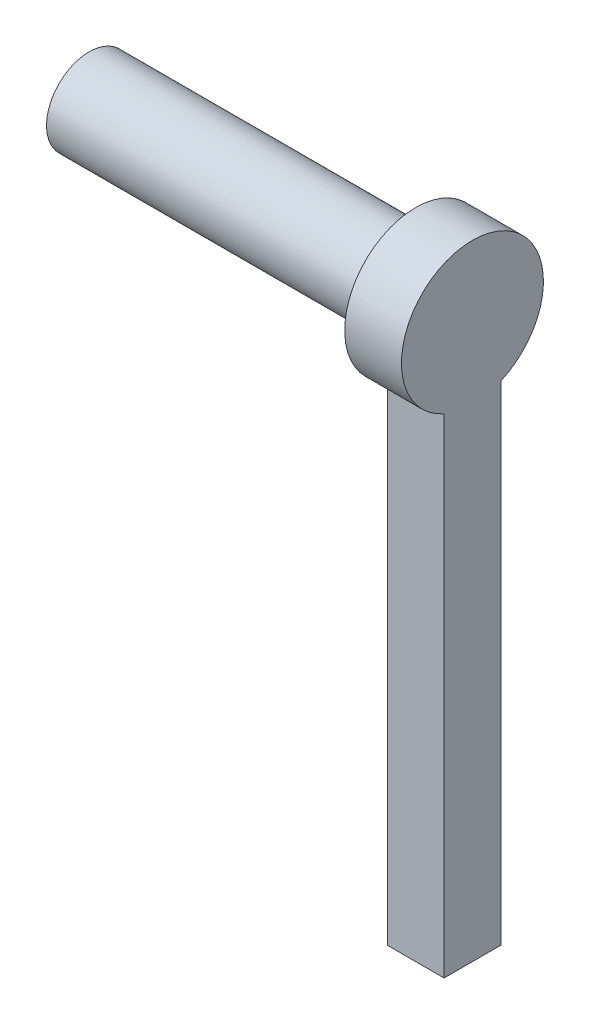
ISO-10303-21;
HEADER;
FILE_DESCRIPTION(('STEP AP214'),'2;1');
FILE_NAME('part.step','',(''),(''),'','','');
FILE_SCHEMA(('AUTOMOTIVE_DESIGN { 1 0 10303 214 1 1 1 1 }'));
ENDSEC;
DATA;
#1=APPLICATION_CONTEXT('core data for automotive mechanical design processes');
#2=APPLICATION_PROTOCOL_DEFINITION('international standard','automotive_design',2000,#1);
#3=PRODUCT_CONTEXT('',#1,'mechanical');
#4=PRODUCT('Part','Part','',(#3));
#5=PRODUCT_RELATED_PRODUCT_CATEGORY('part','',(#4));
#6=PRODUCT_DEFINITION_FORMATION('','',#4);
#7=PRODUCT_DEFINITION_CONTEXT('part definition',#1,'design');
#8=PRODUCT_DEFINITION('design','',#6,#7);
#9=PRODUCT_DEFINITION_SHAPE('','',#8);
#10=(LENGTH_UNIT() NAMED_UNIT(*) SI_UNIT(.MILLI.,.METRE.));
#11=(NAMED_UNIT(*) PLANE_ANGLE_UNIT() SI_UNIT($,.RADIAN.));
#12=(NAMED_UNIT(*) SI_UNIT($,.STERADIAN.) SOLID_ANGLE_UNIT());
#13=UNCERTAINTY_MEASURE_WITH_UNIT(LENGTH_MEASURE(1.E-05),#10,'distance_accuracy_value','');
#14=(GEOMETRIC_REPRESENTATION_CONTEXT(3) GLOBAL_UNCERTAINTY_ASSIGNED_CONTEXT((#13)) GLOBAL_UNIT_ASSIGNED_CONTEXT((#10,
#11,#12)) REPRESENTATION_CONTEXT('',''));
#15=CARTESIAN_POINT('',(0.,0.,0.));
#16=DIRECTION('',(0.,0.,1.));
#17=DIRECTION('',(1.,0.,0.));
#18=AXIS2_PLACEMENT_3D('',#15,#16,#17);
#19=CARTESIAN_POINT('',(-0.5,-29.,-10.5));
#20=DIRECTION('',(-1.,0.,0.));
#21=DIRECTION('',(0.,0.,1.));
#22=AXIS2_PLACEMENT_3D('',#19,#20,#21);
#23=CYLINDRICAL_SURFACE('',#22,1.5);
#24=CARTESIAN_POINT('',(-0.5,-29.,-10.5));
#25=DIRECTION('',(1.,0.,0.));
#26=DIRECTION('',(0.,0.,-1.));
#27=AXIS2_PLACEMENT_3D('',#24,#25,#26);
#28=CIRCLE('',#27,1.5);
#29=CARTESIAN_POINT('',(-0.5,-29.,-12.));
#30=VERTEX_POINT('',#29);
#31=EDGE_CURVE('E11',#30,#30,#28,.T.);
#32=ORIENTED_EDGE('',*,*,#31,.F.);
#33=EDGE_LOOP('',(#32));
#34=FACE_BOUND('',#33,.T.);
#35=CARTESIAN_POINT('',(-12.,-29.,-10.5));
#36=DIRECTION('',(1.,0.,0.));
#37=DIRECTION('',(0.,0.,-1.));
#38=AXIS2_PLACEMENT_3D('',#35,#36,#37);
#39=CIRCLE('',#38,1.5);
#40=CARTESIAN_POINT('',(-12.,-29.,-12.));
#41=VERTEX_POINT('',#40);
#42=EDGE_CURVE('E42',#41,#41,#39,.T.);
#43=ORIENTED_EDGE('',*,*,#42,.T.);
#44=EDGE_LOOP('',(#43));
#45=FACE_BOUND('',#44,.T.);
#46=ADVANCED_FACE('F41',(#34,#45),#23,.T.);
#47=CARTESIAN_POINT('',(-12.,-29.,-10.5));
#48=DIRECTION('',(1.,0.,0.));
#49=DIRECTION('',(0.,0.,-1.));
#50=AXIS2_PLACEMENT_3D('',#47,#48,#49);
#51=PLANE('',#50);
#52=ORIENTED_EDGE('',*,*,#42,.F.);
#53=EDGE_LOOP('',(#52));
#54=FACE_BOUND('',#53,.T.);
#55=ADVANCED_FACE('F128',(#54),#51,.F.);
#56=CARTESIAN_POINT('',(1.5,-29.,-10.5));
#57=DIRECTION('',(-1.,0.,0.));
#58=DIRECTION('',(0.,0.,1.));
#59=AXIS2_PLACEMENT_3D('',#56,#57,#58);
#60=CYLINDRICAL_SURFACE('',#59,2.5);
#61=CARTESIAN_POINT('',(-0.5,-29.,-10.5));
#62=DIRECTION('',(1.,0.,0.));
#63=DIRECTION('',(0.,0.,-1.));
#64=AXIS2_PLACEMENT_3D('',#61,#62,#63);
#65=CIRCLE('',#64,2.5);
#66=CARTESIAN_POINT('',(-0.5,-31.2912878474779,-11.5));
#67=VERTEX_POINT('',#66);
#68=CARTESIAN_POINT('',(-0.5,-31.2912878474779,-9.5));
#69=VERTEX_POINT('',#68);
#70=EDGE_CURVE('E108',#67,#69,#65,.T.);
#71=ORIENTED_EDGE('',*,*,#70,.T.);
#72=DIRECTION('',(-1.,0.,0.));
#73=VECTOR('',#72,1.);
#74=CARTESIAN_POINT('',(1.5,-31.2912878474779,-9.5));
#75=LINE('',#74,#73);
#76=CARTESIAN_POINT('',(1.5,-31.2912878474779,-9.5));
#77=VERTEX_POINT('',#76);
#78=EDGE_CURVE('E54',#69,#77,#75,.F.);
#79=ORIENTED_EDGE('',*,*,#78,.T.);
#80=CARTESIAN_POINT('',(1.5,-29.,-10.5));
#81=DIRECTION('',(1.,0.,0.));
#82=DIRECTION('',(0.,0.,-1.));
#83=AXIS2_PLACEMENT_3D('',#80,#81,#82);
#84=CIRCLE('',#83,2.5);
#85=CARTESIAN_POINT('',(1.5,-31.2912878474779,-11.5));
#86=VERTEX_POINT('',#85);
#87=EDGE_CURVE('E109',#86,#77,#84,.T.);
#88=ORIENTED_EDGE('',*,*,#87,.F.);
#89=DIRECTION('',(-1.,0.,0.));
#90=VECTOR('',#89,1.);
#91=CARTESIAN_POINT('',(1.5,-31.2912878474779,-11.5));
#92=LINE('',#91,#90);
#93=EDGE_CURVE('E58',#67,#86,#92,.F.);
#94=ORIENTED_EDGE('',*,*,#93,.F.);
#95=EDGE_LOOP('',(#71,#79,#88,#94));
#96=FACE_BOUND('',#95,.T.);
#97=ADVANCED_FACE('F115',(#96),#60,.T.);
#98=CARTESIAN_POINT('',(1.5,-29.,-10.5));
#99=DIRECTION('',(1.,0.,0.));
#100=DIRECTION('',(0.,0.,-1.));
#101=AXIS2_PLACEMENT_3D('',#98,#99,#100);
#102=PLANE('',#101);
#103=ORIENTED_EDGE('',*,*,#87,.T.);
#104=DIRECTION('',(0.,1.,0.));
#105=VECTOR('',#104,1.);
#106=CARTESIAN_POINT('',(1.5,-48.5,-9.5));
#107=LINE('',#106,#105);
#108=CARTESIAN_POINT('',(1.5,-48.5,-9.5));
#109=VERTEX_POINT('',#108);
#110=EDGE_CURVE('E96',#109,#77,#107,.T.);
#111=ORIENTED_EDGE('',*,*,#110,.F.);
#112=DIRECTION('',(0.,0.,-1.));
#113=VECTOR('',#112,1.);
#114=CARTESIAN_POINT('',(1.5,-48.5,-9.5));
#115=LINE('',#114,#113);
#116=CARTESIAN_POINT('',(1.5,-48.5,-11.5));
#117=VERTEX_POINT('',#116);
#118=EDGE_CURVE('E94',#109,#117,#115,.T.);
#119=ORIENTED_EDGE('',*,*,#118,.T.);
#120=DIRECTION('',(0.,1.,0.));
#121=VECTOR('',#120,1.);
#122=CARTESIAN_POINT('',(1.5,-48.5,-11.5));
#123=LINE('',#122,#121);
#124=EDGE_CURVE('E87',#117,#86,#123,.T.);
#125=ORIENTED_EDGE('',*,*,#124,.T.);
#126=EDGE_LOOP('',(#103,#111,#119,#125));
#127=FACE_BOUND('',#126,.T.);
#128=ADVANCED_FACE('F125',(#127),#102,.T.);
#129=CARTESIAN_POINT('',(-0.5,-29.,-10.5));
#130=DIRECTION('',(1.,0.,0.));
#131=DIRECTION('',(0.,0.,-1.));
#132=AXIS2_PLACEMENT_3D('',#129,#130,#131);
#133=PLANE('',#132);
#134=ORIENTED_EDGE('',*,*,#70,.F.);
#135=DIRECTION('',(0.,-1.,0.));
#136=VECTOR('',#135,1.);
#137=CARTESIAN_POINT('',(-0.5,-29.,-11.5));
#138=LINE('',#137,#136);
#139=CARTESIAN_POINT('',(-0.5,-48.5,-11.5));
#140=VERTEX_POINT('',#139);
#141=EDGE_CURVE('E101',#67,#140,#138,.T.);
#142=ORIENTED_EDGE('',*,*,#141,.T.);
#143=DIRECTION('',(0.,0.,-1.));
#144=VECTOR('',#143,1.);
#145=CARTESIAN_POINT('',(-0.5,-48.5,-9.5));
#146=LINE('',#145,#144);
#147=CARTESIAN_POINT('',(-0.5,-48.5,-9.5));
#148=VERTEX_POINT('',#147);
#149=EDGE_CURVE('E95',#148,#140,#146,.T.);
#150=ORIENTED_EDGE('',*,*,#149,.F.);
#151=DIRECTION('',(0.,-1.,0.));
#152=VECTOR('',#151,1.);
#153=CARTESIAN_POINT('',(-0.5,-29.,-9.5));
#154=LINE('',#153,#152);
#155=EDGE_CURVE('E78',#69,#148,#154,.T.);
#156=ORIENTED_EDGE('',*,*,#155,.F.);
#157=EDGE_LOOP('',(#134,#142,#150,#156));
#158=FACE_BOUND('',#157,.T.);
#159=ORIENTED_EDGE('',*,*,#31,.T.);
#160=EDGE_LOOP('',(#159));
#161=FACE_BOUND('',#160,.T.);
#162=ADVANCED_FACE('F98',(#158,#161),#133,.F.);
#163=CARTESIAN_POINT('',(0.,0.,-9.5));
#164=DIRECTION('',(0.,0.,1.));
#165=DIRECTION('',(1.,0.,0.));
#166=AXIS2_PLACEMENT_3D('',#163,#164,#165);
#167=PLANE('',#166);
#168=ORIENTED_EDGE('',*,*,#78,.F.);
#169=ORIENTED_EDGE('',*,*,#155,.T.);
#170=DIRECTION('',(1.,0.,0.));
#171=VECTOR('',#170,1.);
#172=CARTESIAN_POINT('',(-0.5,-48.5,-9.5));
#173=LINE('',#172,#171);
#174=EDGE_CURVE('E83',#148,#109,#173,.T.);
#175=ORIENTED_EDGE('',*,*,#174,.T.);
#176=ORIENTED_EDGE('',*,*,#110,.T.);
#177=EDGE_LOOP('',(#168,#169,#175,#176));
#178=FACE_BOUND('',#177,.T.);
#179=ADVANCED_FACE('F82',(#178),#167,.T.);
#180=CARTESIAN_POINT('',(0.,0.,-11.5));
#181=DIRECTION('',(0.,0.,1.));
#182=DIRECTION('',(1.,0.,0.));
#183=AXIS2_PLACEMENT_3D('',#180,#181,#182);
#184=PLANE('',#183);
#185=ORIENTED_EDGE('',*,*,#141,.F.);
#186=ORIENTED_EDGE('',*,*,#93,.T.);
#187=ORIENTED_EDGE('',*,*,#124,.F.);
#188=DIRECTION('',(1.,0.,0.));
#189=VECTOR('',#188,1.);
#190=CARTESIAN_POINT('',(-0.5,-48.5,-11.5));
#191=LINE('',#190,#189);
#192=EDGE_CURVE('E117',#140,#117,#191,.T.);
#193=ORIENTED_EDGE('',*,*,#192,.F.);
#194=EDGE_LOOP('',(#185,#186,#187,#193));
#195=FACE_BOUND('',#194,.T.);
#196=ADVANCED_FACE('F111',(#195),#184,.F.);
#197=CARTESIAN_POINT('',(-0.5,-48.5,-9.5));
#198=DIRECTION('',(0.,1.,0.));
#199=DIRECTION('',(0.,0.,1.));
#200=AXIS2_PLACEMENT_3D('',#197,#198,#199);
#201=PLANE('',#200);
#202=ORIENTED_EDGE('',*,*,#192,.T.);
#203=ORIENTED_EDGE('',*,*,#118,.F.);
#204=ORIENTED_EDGE('',*,*,#174,.F.);
#205=ORIENTED_EDGE('',*,*,#149,.T.);
#206=EDGE_LOOP('',(#202,#203,#204,#205));
#207=FACE_BOUND('',#206,.T.);
#208=ADVANCED_FACE('F93',(#207),#201,.F.);
#209=CLOSED_SHELL('',(#46,#55,#97,#128,#162,#179,#196,#208));
#210=MANIFOLD_SOLID_BREP('B2',#209);
#211=ADVANCED_BREP_SHAPE_REPRESENTATION('',(#18,#210),#14);
#212=SHAPE_DEFINITION_REPRESENTATION(#9,#211);
ENDSEC;
END-ISO-10303-21;
